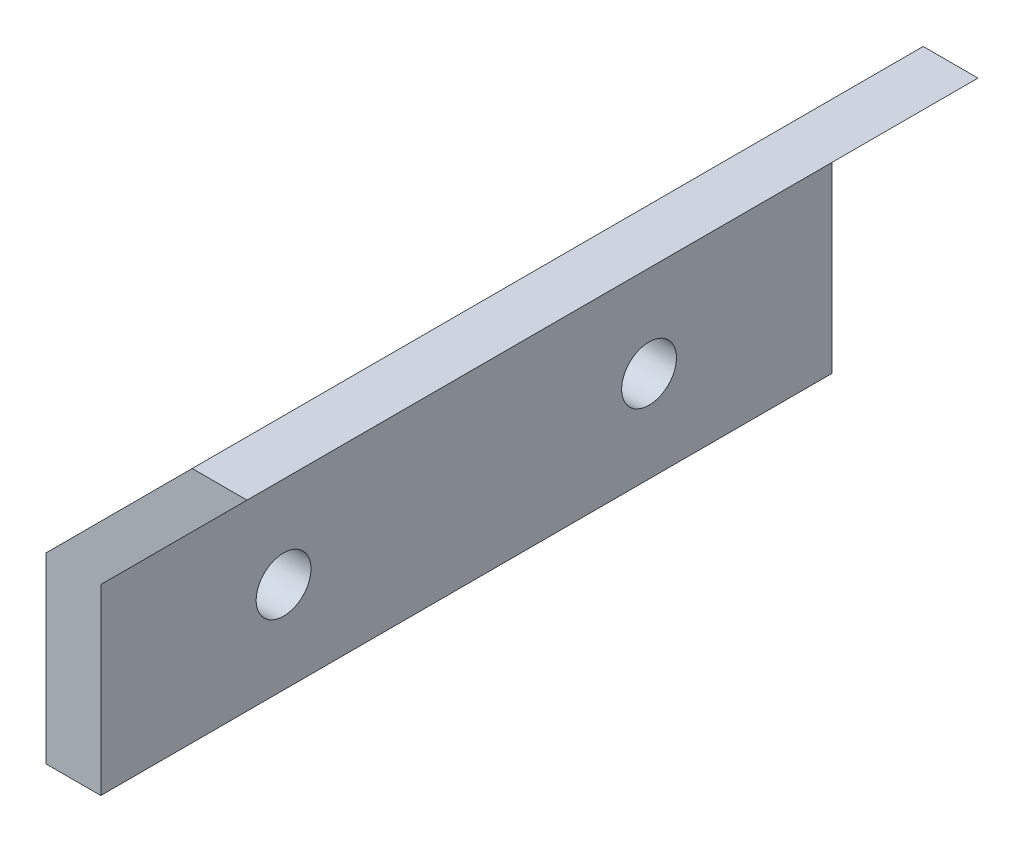
ISO-10303-21;
HEADER;
FILE_DESCRIPTION(('STEP AP214'),'2;1');
FILE_NAME('part.step','',(''),(''),'','','');
FILE_SCHEMA(('AUTOMOTIVE_DESIGN { 1 0 10303 214 1 1 1 1 }'));
ENDSEC;
DATA;
#1=APPLICATION_CONTEXT('core data for automotive mechanical design processes');
#2=APPLICATION_PROTOCOL_DEFINITION('international standard','automotive_design',2000,#1);
#3=PRODUCT_CONTEXT('',#1,'mechanical');
#4=PRODUCT('Part','Part','',(#3));
#5=PRODUCT_RELATED_PRODUCT_CATEGORY('part','',(#4));
#6=PRODUCT_DEFINITION_FORMATION('','',#4);
#7=PRODUCT_DEFINITION_CONTEXT('part definition',#1,'design');
#8=PRODUCT_DEFINITION('design','',#6,#7);
#9=PRODUCT_DEFINITION_SHAPE('','',#8);
#10=(LENGTH_UNIT() NAMED_UNIT(*) SI_UNIT(.MILLI.,.METRE.));
#11=(NAMED_UNIT(*) PLANE_ANGLE_UNIT() SI_UNIT($,.RADIAN.));
#12=(NAMED_UNIT(*) SI_UNIT($,.STERADIAN.) SOLID_ANGLE_UNIT());
#13=UNCERTAINTY_MEASURE_WITH_UNIT(LENGTH_MEASURE(1.E-05),#10,'distance_accuracy_value','');
#14=(GEOMETRIC_REPRESENTATION_CONTEXT(3) GLOBAL_UNCERTAINTY_ASSIGNED_CONTEXT((#13)) GLOBAL_UNIT_ASSIGNED_CONTEXT((#10,
#11,#12)) REPRESENTATION_CONTEXT('',''));
#15=CARTESIAN_POINT('',(0.,0.,0.));
#16=DIRECTION('',(0.,0.,1.));
#17=DIRECTION('',(1.,0.,0.));
#18=AXIS2_PLACEMENT_3D('',#15,#16,#17);
#19=CARTESIAN_POINT('',(3.,0.,40.));
#20=DIRECTION('',(0.,1.,0.));
#21=DIRECTION('',(-1.,0.,0.));
#22=AXIS2_PLACEMENT_3D('',#19,#20,#21);
#23=PLANE('',#22);
#24=DIRECTION('',(1.,0.,0.));
#25=VECTOR('',#24,1.);
#26=CARTESIAN_POINT('',(3.,0.,0.));
#27=LINE('',#26,#25);
#28=CARTESIAN_POINT('',(0.,0.,0.));
#29=VERTEX_POINT('',#28);
#30=CARTESIAN_POINT('',(3.,0.,0.));
#31=VERTEX_POINT('',#30);
#32=EDGE_CURVE('E130',#29,#31,#27,.T.);
#33=ORIENTED_EDGE('',*,*,#32,.T.);
#34=DIRECTION('',(0.,0.,-1.));
#35=VECTOR('',#34,1.);
#36=CARTESIAN_POINT('',(3.,0.,40.));
#37=LINE('',#36,#35);
#38=CARTESIAN_POINT('',(3.,0.,40.));
#39=VERTEX_POINT('',#38);
#40=EDGE_CURVE('E11',#39,#31,#37,.T.);
#41=ORIENTED_EDGE('',*,*,#40,.F.);
#42=DIRECTION('',(1.,0.,0.));
#43=VECTOR('',#42,1.);
#44=CARTESIAN_POINT('',(3.,0.,40.));
#45=LINE('',#44,#43);
#46=CARTESIAN_POINT('',(0.,0.,40.));
#47=VERTEX_POINT('',#46);
#48=EDGE_CURVE('E136',#47,#39,#45,.T.);
#49=ORIENTED_EDGE('',*,*,#48,.F.);
#50=DIRECTION('',(0.,0.,-1.));
#51=VECTOR('',#50,1.);
#52=CARTESIAN_POINT('',(0.,0.,40.));
#53=LINE('',#52,#51);
#54=EDGE_CURVE('E121',#47,#29,#53,.T.);
#55=ORIENTED_EDGE('',*,*,#54,.T.);
#56=EDGE_LOOP('',(#33,#41,#49,#55));
#57=FACE_BOUND('',#56,.T.);
#58=ADVANCED_FACE('F41',(#57),#23,.F.);
#59=CARTESIAN_POINT('',(3.,10.,40.));
#60=DIRECTION('',(-1.,0.,0.));
#61=DIRECTION('',(0.,-1.,0.));
#62=AXIS2_PLACEMENT_3D('',#59,#60,#61);
#63=PLANE('',#62);
#64=CARTESIAN_POINT('',(3.,5.,10.));
#65=DIRECTION('',(1.,0.,0.));
#66=DIRECTION('',(0.,1.,0.));
#67=AXIS2_PLACEMENT_3D('',#64,#65,#66);
#68=CIRCLE('',#67,1.5);
#69=CARTESIAN_POINT('',(3.,6.5,10.));
#70=VERTEX_POINT('',#69);
#71=EDGE_CURVE('E150',#70,#70,#68,.T.);
#72=ORIENTED_EDGE('',*,*,#71,.F.);
#73=EDGE_LOOP('',(#72));
#74=FACE_BOUND('',#73,.T.);
#75=CARTESIAN_POINT('',(3.,5.,30.));
#76=DIRECTION('',(1.,0.,0.));
#77=DIRECTION('',(0.,1.,0.));
#78=AXIS2_PLACEMENT_3D('',#75,#76,#77);
#79=CIRCLE('',#78,1.5);
#80=CARTESIAN_POINT('',(3.,6.5,30.));
#81=VERTEX_POINT('',#80);
#82=EDGE_CURVE('E154',#81,#81,#79,.T.);
#83=ORIENTED_EDGE('',*,*,#82,.F.);
#84=EDGE_LOOP('',(#83));
#85=FACE_BOUND('',#84,.T.);
#86=DIRECTION('',(0.,1.,0.));
#87=VECTOR('',#86,1.);
#88=CARTESIAN_POINT('',(3.,10.,0.));
#89=LINE('',#88,#87);
#90=CARTESIAN_POINT('',(3.,10.,0.));
#91=VERTEX_POINT('',#90);
#92=EDGE_CURVE('E128',#31,#91,#89,.T.);
#93=ORIENTED_EDGE('',*,*,#92,.T.);
#94=DIRECTION('',(0.,0.,-1.));
#95=VECTOR('',#94,1.);
#96=CARTESIAN_POINT('',(3.,10.,40.));
#97=LINE('',#96,#95);
#98=CARTESIAN_POINT('',(3.,10.,40.));
#99=VERTEX_POINT('',#98);
#100=EDGE_CURVE('E49',#99,#91,#97,.T.);
#101=ORIENTED_EDGE('',*,*,#100,.F.);
#102=DIRECTION('',(0.,1.,0.));
#103=VECTOR('',#102,1.);
#104=CARTESIAN_POINT('',(3.,10.,40.));
#105=LINE('',#104,#103);
#106=EDGE_CURVE('E96',#39,#99,#105,.T.);
#107=ORIENTED_EDGE('',*,*,#106,.F.);
#108=ORIENTED_EDGE('',*,*,#40,.T.);
#109=EDGE_LOOP('',(#93,#101,#107,#108));
#110=FACE_BOUND('',#109,.T.);
#111=ADVANCED_FACE('F173',(#74,#85,#110),#63,.F.);
#112=CARTESIAN_POINT('',(3.,10.,40.));
#113=DIRECTION('',(-0.707106781186552,0.707106781186543,0.));
#114=DIRECTION('',(-0.707106781186543,-0.707106781186552,0.));
#115=AXIS2_PLACEMENT_3D('',#112,#113,#114);
#116=PLANE('',#115);
#117=CARTESIAN_POINT('',(7.24264068711926,14.2426406871193,7.));
#118=DIRECTION('',(0.707106781186551,-0.707106781186544,0.));
#119=DIRECTION('',(0.707106781186544,0.707106781186551,0.));
#120=AXIS2_PLACEMENT_3D('',#117,#118,#119);
#121=CIRCLE('',#120,1.6861959379576);
#122=CARTESIAN_POINT('',(8.43496126925828,15.4349612692583,7.));
#123=VERTEX_POINT('',#122);
#124=EDGE_CURVE('E151',#123,#123,#121,.T.);
#125=ORIENTED_EDGE('',*,*,#124,.F.);
#126=EDGE_LOOP('',(#125));
#127=FACE_BOUND('',#126,.T.);
#128=CARTESIAN_POINT('',(7.24264068711926,14.2426406871193,33.));
#129=DIRECTION('',(0.707106781186551,-0.707106781186544,0.));
#130=DIRECTION('',(0.707106781186544,0.707106781186551,0.));
#131=AXIS2_PLACEMENT_3D('',#128,#129,#130);
#132=CIRCLE('',#131,1.8626683492637);
#133=CARTESIAN_POINT('',(8.55974610798517,15.5597461079852,33.));
#134=VERTEX_POINT('',#133);
#135=EDGE_CURVE('E160',#134,#134,#132,.T.);
#136=ORIENTED_EDGE('',*,*,#135,.F.);
#137=EDGE_LOOP('',(#136));
#138=FACE_BOUND('',#137,.T.);
#139=DIRECTION('',(0.707106781186543,0.707106781186552,0.));
#140=VECTOR('',#139,1.);
#141=CARTESIAN_POINT('',(3.,10.,0.));
#142=LINE('',#141,#140);
#143=CARTESIAN_POINT('',(10.9999999999999,18.,0.));
#144=VERTEX_POINT('',#143);
#145=EDGE_CURVE('E131',#91,#144,#142,.T.);
#146=ORIENTED_EDGE('',*,*,#145,.T.);
#147=DIRECTION('',(0.,0.,-1.));
#148=VECTOR('',#147,1.);
#149=CARTESIAN_POINT('',(10.9999999999999,18.,40.));
#150=LINE('',#149,#148);
#151=CARTESIAN_POINT('',(10.9999999999999,18.,40.));
#152=VERTEX_POINT('',#151);
#153=EDGE_CURVE('E116',#152,#144,#150,.T.);
#154=ORIENTED_EDGE('',*,*,#153,.F.);
#155=DIRECTION('',(0.707106781186543,0.707106781186552,0.));
#156=VECTOR('',#155,1.);
#157=CARTESIAN_POINT('',(3.,10.,40.));
#158=LINE('',#157,#156);
#159=EDGE_CURVE('E108',#99,#152,#158,.T.);
#160=ORIENTED_EDGE('',*,*,#159,.F.);
#161=ORIENTED_EDGE('',*,*,#100,.T.);
#162=EDGE_LOOP('',(#146,#154,#160,#161));
#163=FACE_BOUND('',#162,.T.);
#164=ADVANCED_FACE('F172',(#127,#138,#163),#116,.F.);
#165=CARTESIAN_POINT('',(7.99999999999991,18.,40.));
#166=DIRECTION('',(0.,-1.,0.));
#167=DIRECTION('',(0.,0.,-1.));
#168=AXIS2_PLACEMENT_3D('',#165,#166,#167);
#169=PLANE('',#168);
#170=DIRECTION('',(-1.,0.,0.));
#171=VECTOR('',#170,1.);
#172=CARTESIAN_POINT('',(7.99999999999991,18.,0.));
#173=LINE('',#172,#171);
#174=CARTESIAN_POINT('',(7.99999999999991,18.,0.));
#175=VERTEX_POINT('',#174);
#176=EDGE_CURVE('E120',#144,#175,#173,.T.);
#177=ORIENTED_EDGE('',*,*,#176,.T.);
#178=DIRECTION('',(0.,0.,-1.));
#179=VECTOR('',#178,1.);
#180=CARTESIAN_POINT('',(7.99999999999991,18.,40.));
#181=LINE('',#180,#179);
#182=CARTESIAN_POINT('',(7.99999999999991,18.,40.));
#183=VERTEX_POINT('',#182);
#184=EDGE_CURVE('E111',#183,#175,#181,.T.);
#185=ORIENTED_EDGE('',*,*,#184,.F.);
#186=DIRECTION('',(-1.,0.,0.));
#187=VECTOR('',#186,1.);
#188=CARTESIAN_POINT('',(7.99999999999991,18.,40.));
#189=LINE('',#188,#187);
#190=EDGE_CURVE('E103',#152,#183,#189,.T.);
#191=ORIENTED_EDGE('',*,*,#190,.F.);
#192=ORIENTED_EDGE('',*,*,#153,.T.);
#193=EDGE_LOOP('',(#177,#185,#191,#192));
#194=FACE_BOUND('',#193,.T.);
#195=ADVANCED_FACE('F113',(#194),#169,.F.);
#196=CARTESIAN_POINT('',(0.,10.,40.));
#197=DIRECTION('',(0.707106781186552,-0.707106781186544,0.));
#198=DIRECTION('',(0.707106781186544,0.707106781186552,0.));
#199=AXIS2_PLACEMENT_3D('',#196,#197,#198);
#200=PLANE('',#199);
#201=CARTESIAN_POINT('',(5.74264068711924,15.7426406871193,7.));
#202=DIRECTION('',(0.707106781186552,-0.707106781186544,0.));
#203=DIRECTION('',(0.707106781186544,0.707106781186552,0.));
#204=AXIS2_PLACEMENT_3D('',#201,#202,#203);
#205=CIRCLE('',#204,1.6861959379576);
#206=CARTESIAN_POINT('',(6.93496126925826,16.9349612692583,7.));
#207=VERTEX_POINT('',#206);
#208=EDGE_CURVE('E42',#207,#207,#205,.T.);
#209=ORIENTED_EDGE('',*,*,#208,.T.);
#210=EDGE_LOOP('',(#209));
#211=FACE_BOUND('',#210,.T.);
#212=CARTESIAN_POINT('',(5.74264068711924,15.7426406871193,33.));
#213=DIRECTION('',(0.707106781186552,-0.707106781186544,0.));
#214=DIRECTION('',(0.707106781186544,0.707106781186552,0.));
#215=AXIS2_PLACEMENT_3D('',#212,#213,#214);
#216=CIRCLE('',#215,1.8626683492637);
#217=CARTESIAN_POINT('',(7.05974610798515,17.0597461079852,33.));
#218=VERTEX_POINT('',#217);
#219=EDGE_CURVE('E149',#218,#218,#216,.T.);
#220=ORIENTED_EDGE('',*,*,#219,.T.);
#221=EDGE_LOOP('',(#220));
#222=FACE_BOUND('',#221,.T.);
#223=DIRECTION('',(-0.707106781186543,-0.707106781186551,0.));
#224=VECTOR('',#223,1.);
#225=CARTESIAN_POINT('',(0.,10.,0.));
#226=LINE('',#225,#224);
#227=CARTESIAN_POINT('',(0.,10.,0.));
#228=VERTEX_POINT('',#227);
#229=EDGE_CURVE('E85',#175,#228,#226,.T.);
#230=ORIENTED_EDGE('',*,*,#229,.T.);
#231=DIRECTION('',(0.,0.,-1.));
#232=VECTOR('',#231,1.);
#233=CARTESIAN_POINT('',(0.,10.,40.));
#234=LINE('',#233,#232);
#235=CARTESIAN_POINT('',(0.,10.,40.));
#236=VERTEX_POINT('',#235);
#237=EDGE_CURVE('E117',#236,#228,#234,.T.);
#238=ORIENTED_EDGE('',*,*,#237,.F.);
#239=DIRECTION('',(-0.707106781186543,-0.707106781186551,0.));
#240=VECTOR('',#239,1.);
#241=CARTESIAN_POINT('',(0.,10.,40.));
#242=LINE('',#241,#240);
#243=EDGE_CURVE('E110',#183,#236,#242,.T.);
#244=ORIENTED_EDGE('',*,*,#243,.F.);
#245=ORIENTED_EDGE('',*,*,#184,.T.);
#246=EDGE_LOOP('',(#230,#238,#244,#245));
#247=FACE_BOUND('',#246,.T.);
#248=ADVANCED_FACE('F123',(#211,#222,#247),#200,.F.);
#249=CARTESIAN_POINT('',(0.,0.,40.));
#250=DIRECTION('',(1.,0.,0.));
#251=DIRECTION('',(0.,0.,-1.));
#252=AXIS2_PLACEMENT_3D('',#249,#250,#251);
#253=PLANE('',#252);
#254=CARTESIAN_POINT('',(0.,5.,10.));
#255=DIRECTION('',(1.,0.,0.));
#256=DIRECTION('',(0.,0.,-1.));
#257=AXIS2_PLACEMENT_3D('',#254,#255,#256);
#258=CIRCLE('',#257,1.5);
#259=CARTESIAN_POINT('',(0.,5.,8.5));
#260=VERTEX_POINT('',#259);
#261=EDGE_CURVE('E133',#260,#260,#258,.T.);
#262=ORIENTED_EDGE('',*,*,#261,.T.);
#263=EDGE_LOOP('',(#262));
#264=FACE_BOUND('',#263,.T.);
#265=CARTESIAN_POINT('',(0.,5.,30.));
#266=DIRECTION('',(1.,0.,0.));
#267=DIRECTION('',(0.,0.,-1.));
#268=AXIS2_PLACEMENT_3D('',#265,#266,#267);
#269=CIRCLE('',#268,1.5);
#270=CARTESIAN_POINT('',(0.,5.,28.5));
#271=VERTEX_POINT('',#270);
#272=EDGE_CURVE('E145',#271,#271,#269,.T.);
#273=ORIENTED_EDGE('',*,*,#272,.T.);
#274=EDGE_LOOP('',(#273));
#275=FACE_BOUND('',#274,.T.);
#276=DIRECTION('',(0.,-1.,0.));
#277=VECTOR('',#276,1.);
#278=CARTESIAN_POINT('',(0.,0.,0.));
#279=LINE('',#278,#277);
#280=EDGE_CURVE('E86',#228,#29,#279,.T.);
#281=ORIENTED_EDGE('',*,*,#280,.T.);
#282=ORIENTED_EDGE('',*,*,#54,.F.);
#283=DIRECTION('',(0.,-1.,0.));
#284=VECTOR('',#283,1.);
#285=CARTESIAN_POINT('',(0.,0.,40.));
#286=LINE('',#285,#284);
#287=EDGE_CURVE('E56',#236,#47,#286,.T.);
#288=ORIENTED_EDGE('',*,*,#287,.F.);
#289=ORIENTED_EDGE('',*,*,#237,.T.);
#290=EDGE_LOOP('',(#281,#282,#288,#289));
#291=FACE_BOUND('',#290,.T.);
#292=ADVANCED_FACE('F179',(#264,#275,#291),#253,.F.);
#293=CARTESIAN_POINT('',(0.,0.,40.));
#294=DIRECTION('',(0.,0.,-1.));
#295=DIRECTION('',(-1.,0.,0.));
#296=AXIS2_PLACEMENT_3D('',#293,#294,#295);
#297=PLANE('',#296);
#298=ORIENTED_EDGE('',*,*,#48,.T.);
#299=ORIENTED_EDGE('',*,*,#106,.T.);
#300=ORIENTED_EDGE('',*,*,#159,.T.);
#301=ORIENTED_EDGE('',*,*,#190,.T.);
#302=ORIENTED_EDGE('',*,*,#243,.T.);
#303=ORIENTED_EDGE('',*,*,#287,.T.);
#304=EDGE_LOOP('',(#298,#299,#300,#301,#302,#303));
#305=FACE_BOUND('',#304,.T.);
#306=ADVANCED_FACE('F104',(#305),#297,.F.);
#307=CARTESIAN_POINT('',(0.,0.,0.));
#308=DIRECTION('',(0.,0.,-1.));
#309=DIRECTION('',(-1.,0.,0.));
#310=AXIS2_PLACEMENT_3D('',#307,#308,#309);
#311=PLANE('',#310);
#312=ORIENTED_EDGE('',*,*,#32,.F.);
#313=ORIENTED_EDGE('',*,*,#280,.F.);
#314=ORIENTED_EDGE('',*,*,#229,.F.);
#315=ORIENTED_EDGE('',*,*,#176,.F.);
#316=ORIENTED_EDGE('',*,*,#145,.F.);
#317=ORIENTED_EDGE('',*,*,#92,.F.);
#318=EDGE_LOOP('',(#312,#313,#314,#315,#316,#317));
#319=FACE_BOUND('',#318,.T.);
#320=ADVANCED_FACE('F180',(#319),#311,.T.);
#321=CARTESIAN_POINT('',(-7.,5.,30.));
#322=DIRECTION('',(1.,0.,0.));
#323=DIRECTION('',(0.,1.,0.));
#324=AXIS2_PLACEMENT_3D('',#321,#322,#323);
#325=CYLINDRICAL_SURFACE('',#324,1.5);
#326=ORIENTED_EDGE('',*,*,#82,.T.);
#327=EDGE_LOOP('',(#326));
#328=FACE_BOUND('',#327,.T.);
#329=ORIENTED_EDGE('',*,*,#272,.F.);
#330=EDGE_LOOP('',(#329));
#331=FACE_BOUND('',#330,.T.);
#332=ADVANCED_FACE('F225',(#328,#331),#325,.F.);
#333=CARTESIAN_POINT('',(-7.,5.,10.));
#334=DIRECTION('',(1.,0.,0.));
#335=DIRECTION('',(0.,1.,0.));
#336=AXIS2_PLACEMENT_3D('',#333,#334,#335);
#337=CYLINDRICAL_SURFACE('',#336,1.5);
#338=ORIENTED_EDGE('',*,*,#71,.T.);
#339=EDGE_LOOP('',(#338));
#340=FACE_BOUND('',#339,.T.);
#341=ORIENTED_EDGE('',*,*,#261,.F.);
#342=EDGE_LOOP('',(#341));
#343=FACE_BOUND('',#342,.T.);
#344=ADVANCED_FACE('F235',(#340,#343),#337,.F.);
#345=CARTESIAN_POINT('',(0.171572875253745,21.3137084989847,33.));
#346=DIRECTION('',(0.707106781186551,-0.707106781186544,0.));
#347=DIRECTION('',(0.707106781186544,0.707106781186551,0.));
#348=AXIS2_PLACEMENT_3D('',#345,#346,#347);
#349=CYLINDRICAL_SURFACE('',#348,1.8626683492637);
#350=ORIENTED_EDGE('',*,*,#135,.T.);
#351=EDGE_LOOP('',(#350));
#352=FACE_BOUND('',#351,.T.);
#353=ORIENTED_EDGE('',*,*,#219,.F.);
#354=EDGE_LOOP('',(#353));
#355=FACE_BOUND('',#354,.T.);
#356=ADVANCED_FACE('F245',(#352,#355),#349,.F.);
#357=CARTESIAN_POINT('',(0.171572875253748,21.3137084989847,7.));
#358=DIRECTION('',(0.707106781186551,-0.707106781186544,0.));
#359=DIRECTION('',(0.707106781186544,0.707106781186551,0.));
#360=AXIS2_PLACEMENT_3D('',#357,#358,#359);
#361=CYLINDRICAL_SURFACE('',#360,1.6861959379576);
#362=ORIENTED_EDGE('',*,*,#124,.T.);
#363=EDGE_LOOP('',(#362));
#364=FACE_BOUND('',#363,.T.);
#365=ORIENTED_EDGE('',*,*,#208,.F.);
#366=EDGE_LOOP('',(#365));
#367=FACE_BOUND('',#366,.T.);
#368=ADVANCED_FACE('F252',(#364,#367),#361,.F.);
#369=CLOSED_SHELL('',(#58,#111,#164,#195,#248,#292,#306,#320,#332,#344,#356,#368));
#370=MANIFOLD_SOLID_BREP('B2',#369);
#371=ADVANCED_BREP_SHAPE_REPRESENTATION('',(#18,#370),#14);
#372=SHAPE_DEFINITION_REPRESENTATION(#9,#371);
ENDSEC;
END-ISO-10303-21;
